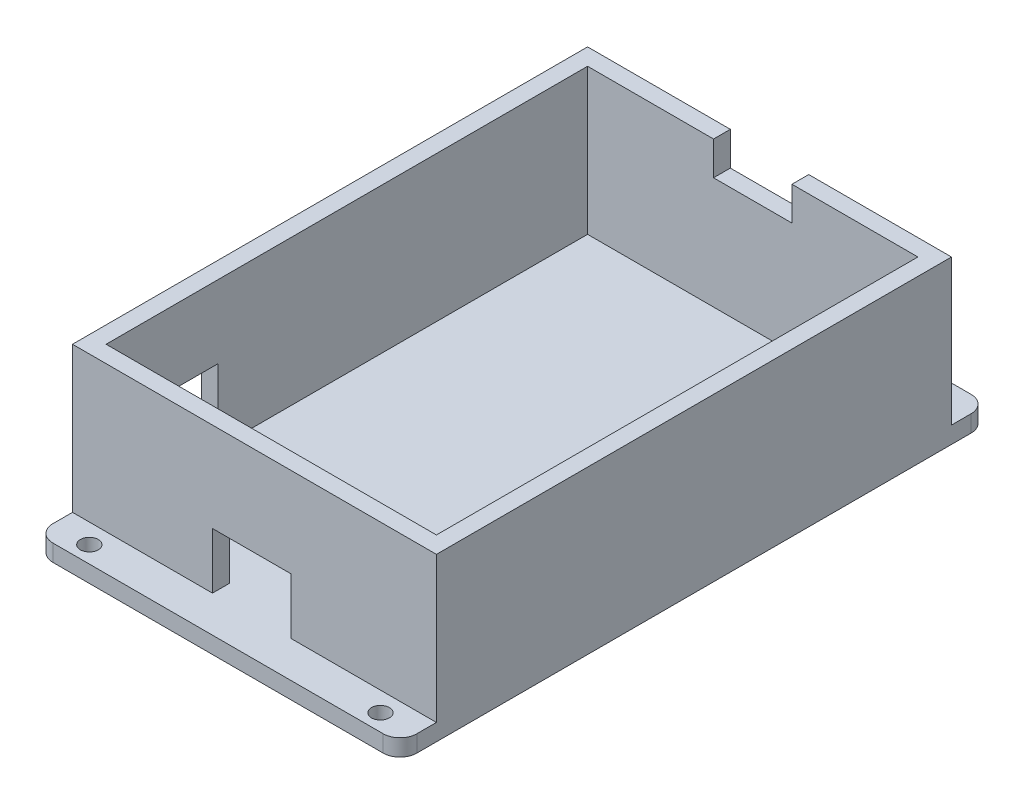
ISO-10303-21;
HEADER;
FILE_DESCRIPTION(('STEP AP214'),'2;1');
FILE_NAME('part.step','',(''),(''),'','','');
FILE_SCHEMA(('AUTOMOTIVE_DESIGN { 1 0 10303 214 1 1 1 1 }'));
ENDSEC;
DATA;
#1=APPLICATION_CONTEXT('core data for automotive mechanical design processes');
#2=APPLICATION_PROTOCOL_DEFINITION('international standard','automotive_design',2000,#1);
#3=PRODUCT_CONTEXT('',#1,'mechanical');
#4=PRODUCT('Part','Part','',(#3));
#5=PRODUCT_RELATED_PRODUCT_CATEGORY('part','',(#4));
#6=PRODUCT_DEFINITION_FORMATION('','',#4);
#7=PRODUCT_DEFINITION_CONTEXT('part definition',#1,'design');
#8=PRODUCT_DEFINITION('design','',#6,#7);
#9=PRODUCT_DEFINITION_SHAPE('','',#8);
#10=(LENGTH_UNIT() NAMED_UNIT(*) SI_UNIT(.MILLI.,.METRE.));
#11=(NAMED_UNIT(*) PLANE_ANGLE_UNIT() SI_UNIT($,.RADIAN.));
#12=(NAMED_UNIT(*) SI_UNIT($,.STERADIAN.) SOLID_ANGLE_UNIT());
#13=UNCERTAINTY_MEASURE_WITH_UNIT(LENGTH_MEASURE(1.E-05),#10,'distance_accuracy_value','');
#14=(GEOMETRIC_REPRESENTATION_CONTEXT(3) GLOBAL_UNCERTAINTY_ASSIGNED_CONTEXT((#13)) GLOBAL_UNIT_ASSIGNED_CONTEXT((#10,
#11,#12)) REPRESENTATION_CONTEXT('',''));
#15=CARTESIAN_POINT('',(0.,0.,0.));
#16=DIRECTION('',(0.,0.,1.));
#17=DIRECTION('',(1.,0.,0.));
#18=AXIS2_PLACEMENT_3D('',#15,#16,#17);
#19=CARTESIAN_POINT('',(0.,26.,0.));
#20=DIRECTION('',(0.,-1.,0.));
#21=DIRECTION('',(0.,0.,-1.));
#22=AXIS2_PLACEMENT_3D('',#19,#20,#21);
#23=PLANE('',#22);
#24=DIRECTION('',(-1.,0.,0.));
#25=VECTOR('',#24,1.);
#26=CARTESIAN_POINT('',(-29.5,26.,-43.));
#27=LINE('',#26,#25);
#28=CARTESIAN_POINT('',(-7.,26.,-43.));
#29=VERTEX_POINT('',#28);
#30=CARTESIAN_POINT('',(-29.5,26.,-43.));
#31=VERTEX_POINT('',#30);
#32=EDGE_CURVE('E362',#29,#31,#27,.T.);
#33=ORIENTED_EDGE('',*,*,#32,.F.);
#34=DIRECTION('',(0.,0.,-1.));
#35=VECTOR('',#34,1.);
#36=CARTESIAN_POINT('',(-7.,26.,-36.));
#37=LINE('',#36,#35);
#38=CARTESIAN_POINT('',(-7.,26.,-46.));
#39=VERTEX_POINT('',#38);
#40=EDGE_CURVE('E560',#29,#39,#37,.T.);
#41=ORIENTED_EDGE('',*,*,#40,.T.);
#42=DIRECTION('',(-1.,0.,0.));
#43=VECTOR('',#42,1.);
#44=CARTESIAN_POINT('',(-32.5,26.,-46.));
#45=LINE('',#44,#43);
#46=CARTESIAN_POINT('',(-32.5,26.,-46.));
#47=VERTEX_POINT('',#46);
#48=EDGE_CURVE('E257',#39,#47,#45,.T.);
#49=ORIENTED_EDGE('',*,*,#48,.T.);
#50=DIRECTION('',(0.,0.,1.));
#51=VECTOR('',#50,1.);
#52=CARTESIAN_POINT('',(-32.5,26.,46.));
#53=LINE('',#52,#51);
#54=CARTESIAN_POINT('',(-32.5,26.,46.));
#55=VERTEX_POINT('',#54);
#56=EDGE_CURVE('E256',#47,#55,#53,.T.);
#57=ORIENTED_EDGE('',*,*,#56,.T.);
#58=DIRECTION('',(1.,0.,0.));
#59=VECTOR('',#58,1.);
#60=CARTESIAN_POINT('',(-32.5,26.,46.));
#61=LINE('',#60,#59);
#62=CARTESIAN_POINT('',(32.5,26.,46.));
#63=VERTEX_POINT('',#62);
#64=EDGE_CURVE('E261',#55,#63,#61,.T.);
#65=ORIENTED_EDGE('',*,*,#64,.T.);
#66=DIRECTION('',(0.,0.,-1.));
#67=VECTOR('',#66,1.);
#68=CARTESIAN_POINT('',(32.5,26.,46.));
#69=LINE('',#68,#67);
#70=CARTESIAN_POINT('',(32.5,26.,-46.));
#71=VERTEX_POINT('',#70);
#72=EDGE_CURVE('E253',#63,#71,#69,.T.);
#73=ORIENTED_EDGE('',*,*,#72,.T.);
#74=CARTESIAN_POINT('',(7.,26.,-46.));
#75=VERTEX_POINT('',#74);
#76=EDGE_CURVE('E244',#71,#75,#45,.T.);
#77=ORIENTED_EDGE('',*,*,#76,.T.);
#78=DIRECTION('',(0.,0.,-1.));
#79=VECTOR('',#78,1.);
#80=CARTESIAN_POINT('',(7.,26.,-36.));
#81=LINE('',#80,#79);
#82=CARTESIAN_POINT('',(7.,26.,-43.));
#83=VERTEX_POINT('',#82);
#84=EDGE_CURVE('E226',#83,#75,#81,.T.);
#85=ORIENTED_EDGE('',*,*,#84,.F.);
#86=CARTESIAN_POINT('',(29.5,26.,-43.));
#87=VERTEX_POINT('',#86);
#88=EDGE_CURVE('E357',#87,#83,#27,.T.);
#89=ORIENTED_EDGE('',*,*,#88,.F.);
#90=DIRECTION('',(0.,0.,-1.));
#91=VECTOR('',#90,1.);
#92=CARTESIAN_POINT('',(29.5,26.,43.));
#93=LINE('',#92,#91);
#94=CARTESIAN_POINT('',(29.5,26.,43.));
#95=VERTEX_POINT('',#94);
#96=EDGE_CURVE('E369',#95,#87,#93,.T.);
#97=ORIENTED_EDGE('',*,*,#96,.F.);
#98=DIRECTION('',(1.,0.,0.));
#99=VECTOR('',#98,1.);
#100=CARTESIAN_POINT('',(-29.5,26.,43.));
#101=LINE('',#100,#99);
#102=CARTESIAN_POINT('',(-29.5,26.,43.));
#103=VERTEX_POINT('',#102);
#104=EDGE_CURVE('E367',#103,#95,#101,.T.);
#105=ORIENTED_EDGE('',*,*,#104,.F.);
#106=DIRECTION('',(0.,0.,1.));
#107=VECTOR('',#106,1.);
#108=CARTESIAN_POINT('',(-29.5,26.,43.));
#109=LINE('',#108,#107);
#110=EDGE_CURVE('E361',#31,#103,#109,.T.);
#111=ORIENTED_EDGE('',*,*,#110,.F.);
#112=EDGE_LOOP('',(#33,#41,#49,#57,#65,#73,#77,#85,#89,#97,#105,#111));
#113=FACE_BOUND('',#112,.T.);
#114=ADVANCED_FACE('F43',(#113),#23,.F.);
#115=CARTESIAN_POINT('',(32.5,26.,46.));
#116=DIRECTION('',(-1.,0.,0.));
#117=DIRECTION('',(0.,0.,1.));
#118=AXIS2_PLACEMENT_3D('',#115,#116,#117);
#119=PLANE('',#118);
#120=DIRECTION('',(0.,0.,1.));
#121=VECTOR('',#120,1.);
#122=CARTESIAN_POINT('',(32.5,0.,-52.5));
#123=LINE('',#122,#121);
#124=CARTESIAN_POINT('',(32.5,0.,46.));
#125=VERTEX_POINT('',#124);
#126=CARTESIAN_POINT('',(32.5,0.,49.5));
#127=VERTEX_POINT('',#126);
#128=EDGE_CURVE('E449',#125,#127,#123,.T.);
#129=ORIENTED_EDGE('',*,*,#128,.T.);
#130=DIRECTION('',(0.,1.,0.));
#131=VECTOR('',#130,1.);
#132=CARTESIAN_POINT('',(32.5,26.,49.5));
#133=LINE('',#132,#131);
#134=CARTESIAN_POINT('',(32.5,-3.,49.5));
#135=VERTEX_POINT('',#134);
#136=EDGE_CURVE('E311',#127,#135,#133,.F.);
#137=ORIENTED_EDGE('',*,*,#136,.T.);
#138=DIRECTION('',(0.,0.,1.));
#139=VECTOR('',#138,1.);
#140=CARTESIAN_POINT('',(32.5,-3.,-52.5));
#141=LINE('',#140,#139);
#142=CARTESIAN_POINT('',(32.5,-3.,-49.5));
#143=VERTEX_POINT('',#142);
#144=EDGE_CURVE('E430',#143,#135,#141,.T.);
#145=ORIENTED_EDGE('',*,*,#144,.F.);
#146=DIRECTION('',(0.,1.,0.));
#147=VECTOR('',#146,1.);
#148=CARTESIAN_POINT('',(32.5,26.,-49.5));
#149=LINE('',#148,#147);
#150=CARTESIAN_POINT('',(32.5,0.,-49.5));
#151=VERTEX_POINT('',#150);
#152=EDGE_CURVE('E307',#143,#151,#149,.T.);
#153=ORIENTED_EDGE('',*,*,#152,.T.);
#154=CARTESIAN_POINT('',(32.5,0.,-46.));
#155=VERTEX_POINT('',#154);
#156=EDGE_CURVE('E446',#151,#155,#123,.T.);
#157=ORIENTED_EDGE('',*,*,#156,.T.);
#158=DIRECTION('',(0.,-1.,0.));
#159=VECTOR('',#158,1.);
#160=CARTESIAN_POINT('',(32.5,26.,-46.));
#161=LINE('',#160,#159);
#162=EDGE_CURVE('E290',#71,#155,#161,.T.);
#163=ORIENTED_EDGE('',*,*,#162,.F.);
#164=ORIENTED_EDGE('',*,*,#72,.F.);
#165=DIRECTION('',(0.,-1.,0.));
#166=VECTOR('',#165,1.);
#167=CARTESIAN_POINT('',(32.5,26.,46.));
#168=LINE('',#167,#166);
#169=EDGE_CURVE('E268',#63,#125,#168,.T.);
#170=ORIENTED_EDGE('',*,*,#169,.T.);
#171=EDGE_LOOP('',(#129,#137,#145,#153,#157,#163,#164,#170));
#172=FACE_BOUND('',#171,.T.);
#173=ADVANCED_FACE('F617',(#172),#119,.F.);
#174=CARTESIAN_POINT('',(-32.5,26.,-46.));
#175=DIRECTION('',(0.,0.,1.));
#176=DIRECTION('',(1.,0.,0.));
#177=AXIS2_PLACEMENT_3D('',#174,#175,#176);
#178=PLANE('',#177);
#179=ORIENTED_EDGE('',*,*,#48,.F.);
#180=DIRECTION('',(0.,1.,0.));
#181=VECTOR('',#180,1.);
#182=CARTESIAN_POINT('',(-7.,20.,-46.));
#183=LINE('',#182,#181);
#184=CARTESIAN_POINT('',(-7.,20.,-46.));
#185=VERTEX_POINT('',#184);
#186=EDGE_CURVE('E238',#185,#39,#183,.T.);
#187=ORIENTED_EDGE('',*,*,#186,.F.);
#188=DIRECTION('',(-1.,0.,0.));
#189=VECTOR('',#188,1.);
#190=CARTESIAN_POINT('',(7.,20.,-46.));
#191=LINE('',#190,#189);
#192=CARTESIAN_POINT('',(7.,20.,-46.));
#193=VERTEX_POINT('',#192);
#194=EDGE_CURVE('E248',#193,#185,#191,.T.);
#195=ORIENTED_EDGE('',*,*,#194,.F.);
#196=DIRECTION('',(0.,-1.,0.));
#197=VECTOR('',#196,1.);
#198=CARTESIAN_POINT('',(7.,26.,-46.));
#199=LINE('',#198,#197);
#200=EDGE_CURVE('E229',#75,#193,#199,.T.);
#201=ORIENTED_EDGE('',*,*,#200,.F.);
#202=ORIENTED_EDGE('',*,*,#76,.F.);
#203=ORIENTED_EDGE('',*,*,#162,.T.);
#204=DIRECTION('',(-1.,0.,0.));
#205=VECTOR('',#204,1.);
#206=CARTESIAN_POINT('',(-32.5,0.,-46.));
#207=LINE('',#206,#205);
#208=CARTESIAN_POINT('',(-32.5,0.,-46.));
#209=VERTEX_POINT('',#208);
#210=EDGE_CURVE('E269',#155,#209,#207,.T.);
#211=ORIENTED_EDGE('',*,*,#210,.T.);
#212=DIRECTION('',(0.,-1.,0.));
#213=VECTOR('',#212,1.);
#214=CARTESIAN_POINT('',(-32.5,26.,-46.));
#215=LINE('',#214,#213);
#216=EDGE_CURVE('E286',#47,#209,#215,.T.);
#217=ORIENTED_EDGE('',*,*,#216,.F.);
#218=EDGE_LOOP('',(#179,#187,#195,#201,#202,#203,#211,#217));
#219=FACE_BOUND('',#218,.T.);
#220=ADVANCED_FACE('F242',(#219),#178,.F.);
#221=CARTESIAN_POINT('',(-32.5,26.,46.));
#222=DIRECTION('',(1.,0.,0.));
#223=DIRECTION('',(0.,0.,-1.));
#224=AXIS2_PLACEMENT_3D('',#221,#222,#223);
#225=PLANE('',#224);
#226=DIRECTION('',(0.,-1.,0.));
#227=VECTOR('',#226,1.);
#228=CARTESIAN_POINT('',(-32.5,2.,33.));
#229=LINE('',#228,#227);
#230=CARTESIAN_POINT('',(-32.5,13.,33.));
#231=VERTEX_POINT('',#230);
#232=CARTESIAN_POINT('',(-32.5,2.,33.));
#233=VERTEX_POINT('',#232);
#234=EDGE_CURVE('E531',#231,#233,#229,.T.);
#235=ORIENTED_EDGE('',*,*,#234,.T.);
#236=DIRECTION('',(0.,0.,-1.));
#237=VECTOR('',#236,1.);
#238=CARTESIAN_POINT('',(-32.5,2.,33.));
#239=LINE('',#238,#237);
#240=CARTESIAN_POINT('',(-32.5,2.,23.));
#241=VERTEX_POINT('',#240);
#242=EDGE_CURVE('E541',#233,#241,#239,.T.);
#243=ORIENTED_EDGE('',*,*,#242,.T.);
#244=DIRECTION('',(0.,1.,0.));
#245=VECTOR('',#244,1.);
#246=CARTESIAN_POINT('',(-32.5,13.,23.));
#247=LINE('',#246,#245);
#248=CARTESIAN_POINT('',(-32.5,13.,23.));
#249=VERTEX_POINT('',#248);
#250=EDGE_CURVE('E537',#241,#249,#247,.T.);
#251=ORIENTED_EDGE('',*,*,#250,.T.);
#252=DIRECTION('',(0.,0.,1.));
#253=VECTOR('',#252,1.);
#254=CARTESIAN_POINT('',(-32.5,13.,33.));
#255=LINE('',#254,#253);
#256=EDGE_CURVE('E67',#249,#231,#255,.T.);
#257=ORIENTED_EDGE('',*,*,#256,.T.);
#258=EDGE_LOOP('',(#235,#243,#251,#257));
#259=FACE_BOUND('',#258,.T.);
#260=DIRECTION('',(0.,0.,-1.));
#261=VECTOR('',#260,1.);
#262=CARTESIAN_POINT('',(-32.5,-3.,-52.5));
#263=LINE('',#262,#261);
#264=CARTESIAN_POINT('',(-32.5,-3.,49.5));
#265=VERTEX_POINT('',#264);
#266=CARTESIAN_POINT('',(-32.5,-3.,-49.5));
#267=VERTEX_POINT('',#266);
#268=EDGE_CURVE('E422',#265,#267,#263,.T.);
#269=ORIENTED_EDGE('',*,*,#268,.F.);
#270=DIRECTION('',(0.,1.,0.));
#271=VECTOR('',#270,1.);
#272=CARTESIAN_POINT('',(-32.5,26.,49.5));
#273=LINE('',#272,#271);
#274=CARTESIAN_POINT('',(-32.5,0.,49.5));
#275=VERTEX_POINT('',#274);
#276=EDGE_CURVE('E329',#265,#275,#273,.T.);
#277=ORIENTED_EDGE('',*,*,#276,.T.);
#278=DIRECTION('',(0.,0.,-1.));
#279=VECTOR('',#278,1.);
#280=CARTESIAN_POINT('',(-32.5,0.,-52.5));
#281=LINE('',#280,#279);
#282=CARTESIAN_POINT('',(-32.5,0.,46.));
#283=VERTEX_POINT('',#282);
#284=EDGE_CURVE('E438',#275,#283,#281,.T.);
#285=ORIENTED_EDGE('',*,*,#284,.T.);
#286=DIRECTION('',(0.,-1.,0.));
#287=VECTOR('',#286,1.);
#288=CARTESIAN_POINT('',(-32.5,26.,46.));
#289=LINE('',#288,#287);
#290=EDGE_CURVE('E282',#55,#283,#289,.T.);
#291=ORIENTED_EDGE('',*,*,#290,.F.);
#292=ORIENTED_EDGE('',*,*,#56,.F.);
#293=ORIENTED_EDGE('',*,*,#216,.T.);
#294=CARTESIAN_POINT('',(-32.5,0.,-49.5));
#295=VERTEX_POINT('',#294);
#296=EDGE_CURVE('E440',#209,#295,#281,.T.);
#297=ORIENTED_EDGE('',*,*,#296,.T.);
#298=DIRECTION('',(0.,1.,0.));
#299=VECTOR('',#298,1.);
#300=CARTESIAN_POINT('',(-32.5,26.,-49.5));
#301=LINE('',#300,#299);
#302=EDGE_CURVE('E326',#295,#267,#301,.F.);
#303=ORIENTED_EDGE('',*,*,#302,.T.);
#304=EDGE_LOOP('',(#269,#277,#285,#291,#292,#293,#297,#303));
#305=FACE_BOUND('',#304,.T.);
#306=ADVANCED_FACE('F598',(#259,#305),#225,.F.);
#307=CARTESIAN_POINT('',(-32.5,26.,46.));
#308=DIRECTION('',(0.,0.,-1.));
#309=DIRECTION('',(-1.,0.,0.));
#310=AXIS2_PLACEMENT_3D('',#307,#308,#309);
#311=PLANE('',#310);
#312=DIRECTION('',(1.,0.,0.));
#313=VECTOR('',#312,1.);
#314=CARTESIAN_POINT('',(-32.5,10.,46.));
#315=LINE('',#314,#313);
#316=CARTESIAN_POINT('',(-7.50000000000001,10.,46.));
#317=VERTEX_POINT('',#316);
#318=CARTESIAN_POINT('',(6.49999999999999,10.,46.));
#319=VERTEX_POINT('',#318);
#320=EDGE_CURVE('E484',#317,#319,#315,.T.);
#321=ORIENTED_EDGE('',*,*,#320,.T.);
#322=DIRECTION('',(0.,-1.,0.));
#323=VECTOR('',#322,1.);
#324=CARTESIAN_POINT('',(6.49999999999998,26.,46.));
#325=LINE('',#324,#323);
#326=CARTESIAN_POINT('',(6.49999999999999,0.,46.));
#327=VERTEX_POINT('',#326);
#328=EDGE_CURVE('E488',#319,#327,#325,.T.);
#329=ORIENTED_EDGE('',*,*,#328,.T.);
#330=DIRECTION('',(1.,0.,0.));
#331=VECTOR('',#330,1.);
#332=CARTESIAN_POINT('',(-32.5,0.,46.));
#333=LINE('',#332,#331);
#334=EDGE_CURVE('E273',#327,#125,#333,.T.);
#335=ORIENTED_EDGE('',*,*,#334,.T.);
#336=ORIENTED_EDGE('',*,*,#169,.F.);
#337=ORIENTED_EDGE('',*,*,#64,.F.);
#338=ORIENTED_EDGE('',*,*,#290,.T.);
#339=CARTESIAN_POINT('',(-7.50000000000001,0.,46.));
#340=VERTEX_POINT('',#339);
#341=EDGE_CURVE('E275',#283,#340,#333,.T.);
#342=ORIENTED_EDGE('',*,*,#341,.T.);
#343=DIRECTION('',(0.,1.,0.));
#344=VECTOR('',#343,1.);
#345=CARTESIAN_POINT('',(-7.5,26.,46.));
#346=LINE('',#345,#344);
#347=EDGE_CURVE('E492',#340,#317,#346,.T.);
#348=ORIENTED_EDGE('',*,*,#347,.T.);
#349=EDGE_LOOP('',(#321,#329,#335,#336,#337,#338,#342,#348));
#350=FACE_BOUND('',#349,.T.);
#351=ADVANCED_FACE('F590',(#350),#311,.F.);
#352=CARTESIAN_POINT('',(29.5,26.,43.));
#353=DIRECTION('',(-1.,0.,0.));
#354=DIRECTION('',(0.,0.,1.));
#355=AXIS2_PLACEMENT_3D('',#352,#353,#354);
#356=PLANE('',#355);
#357=DIRECTION('',(0.,0.,-1.));
#358=VECTOR('',#357,1.);
#359=CARTESIAN_POINT('',(29.5,0.,43.));
#360=LINE('',#359,#358);
#361=CARTESIAN_POINT('',(29.5,0.,43.));
#362=VERTEX_POINT('',#361);
#363=CARTESIAN_POINT('',(29.5,0.,-43.));
#364=VERTEX_POINT('',#363);
#365=EDGE_CURVE('E376',#362,#364,#360,.T.);
#366=ORIENTED_EDGE('',*,*,#365,.F.);
#367=DIRECTION('',(0.,-1.,0.));
#368=VECTOR('',#367,1.);
#369=CARTESIAN_POINT('',(29.5,26.,43.));
#370=LINE('',#369,#368);
#371=EDGE_CURVE('E375',#95,#362,#370,.T.);
#372=ORIENTED_EDGE('',*,*,#371,.F.);
#373=ORIENTED_EDGE('',*,*,#96,.T.);
#374=DIRECTION('',(0.,-1.,0.));
#375=VECTOR('',#374,1.);
#376=CARTESIAN_POINT('',(29.5,26.,-43.));
#377=LINE('',#376,#375);
#378=EDGE_CURVE('E274',#87,#364,#377,.T.);
#379=ORIENTED_EDGE('',*,*,#378,.T.);
#380=EDGE_LOOP('',(#366,#372,#373,#379));
#381=FACE_BOUND('',#380,.T.);
#382=ADVANCED_FACE('F406',(#381),#356,.T.);
#383=CARTESIAN_POINT('',(-29.5,26.,-43.));
#384=DIRECTION('',(0.,0.,1.));
#385=DIRECTION('',(1.,0.,0.));
#386=AXIS2_PLACEMENT_3D('',#383,#384,#385);
#387=PLANE('',#386);
#388=DIRECTION('',(0.,-1.,0.));
#389=VECTOR('',#388,1.);
#390=CARTESIAN_POINT('',(-7.,26.,-43.));
#391=LINE('',#390,#389);
#392=CARTESIAN_POINT('',(-7.,20.,-43.));
#393=VERTEX_POINT('',#392);
#394=EDGE_CURVE('E11',#29,#393,#391,.T.);
#395=ORIENTED_EDGE('',*,*,#394,.F.);
#396=ORIENTED_EDGE('',*,*,#32,.T.);
#397=DIRECTION('',(0.,-1.,0.));
#398=VECTOR('',#397,1.);
#399=CARTESIAN_POINT('',(-29.5,26.,-43.));
#400=LINE('',#399,#398);
#401=CARTESIAN_POINT('',(-29.5,0.,-43.));
#402=VERTEX_POINT('',#401);
#403=EDGE_CURVE('E401',#31,#402,#400,.T.);
#404=ORIENTED_EDGE('',*,*,#403,.T.);
#405=DIRECTION('',(-1.,0.,0.));
#406=VECTOR('',#405,1.);
#407=CARTESIAN_POINT('',(-29.5,0.,-43.));
#408=LINE('',#407,#406);
#409=EDGE_CURVE('E380',#364,#402,#408,.T.);
#410=ORIENTED_EDGE('',*,*,#409,.F.);
#411=ORIENTED_EDGE('',*,*,#378,.F.);
#412=ORIENTED_EDGE('',*,*,#88,.T.);
#413=DIRECTION('',(0.,1.,0.));
#414=VECTOR('',#413,1.);
#415=CARTESIAN_POINT('',(7.,26.,-43.));
#416=LINE('',#415,#414);
#417=CARTESIAN_POINT('',(7.,20.,-43.));
#418=VERTEX_POINT('',#417);
#419=EDGE_CURVE('E232',#418,#83,#416,.T.);
#420=ORIENTED_EDGE('',*,*,#419,.F.);
#421=DIRECTION('',(1.,0.,0.));
#422=VECTOR('',#421,1.);
#423=CARTESIAN_POINT('',(-29.5,20.,-43.));
#424=LINE('',#423,#422);
#425=EDGE_CURVE('E52',#393,#418,#424,.T.);
#426=ORIENTED_EDGE('',*,*,#425,.F.);
#427=EDGE_LOOP('',(#395,#396,#404,#410,#411,#412,#420,#426));
#428=FACE_BOUND('',#427,.T.);
#429=ADVANCED_FACE('F355',(#428),#387,.T.);
#430=CARTESIAN_POINT('',(-29.5,26.,43.));
#431=DIRECTION('',(1.,0.,0.));
#432=DIRECTION('',(0.,0.,-1.));
#433=AXIS2_PLACEMENT_3D('',#430,#431,#432);
#434=PLANE('',#433);
#435=DIRECTION('',(0.,0.,-1.));
#436=VECTOR('',#435,1.);
#437=CARTESIAN_POINT('',(-29.5,2.,33.));
#438=LINE('',#437,#436);
#439=CARTESIAN_POINT('',(-29.5,2.,33.));
#440=VERTEX_POINT('',#439);
#441=CARTESIAN_POINT('',(-29.5,2.,23.));
#442=VERTEX_POINT('',#441);
#443=EDGE_CURVE('E557',#440,#442,#438,.T.);
#444=ORIENTED_EDGE('',*,*,#443,.F.);
#445=DIRECTION('',(0.,-1.,0.));
#446=VECTOR('',#445,1.);
#447=CARTESIAN_POINT('',(-29.5,2.,33.));
#448=LINE('',#447,#446);
#449=CARTESIAN_POINT('',(-29.5,13.,33.));
#450=VERTEX_POINT('',#449);
#451=EDGE_CURVE('E545',#450,#440,#448,.T.);
#452=ORIENTED_EDGE('',*,*,#451,.F.);
#453=DIRECTION('',(0.,0.,1.));
#454=VECTOR('',#453,1.);
#455=CARTESIAN_POINT('',(-29.5,13.,33.));
#456=LINE('',#455,#454);
#457=CARTESIAN_POINT('',(-29.5,13.,23.));
#458=VERTEX_POINT('',#457);
#459=EDGE_CURVE('E549',#458,#450,#456,.T.);
#460=ORIENTED_EDGE('',*,*,#459,.F.);
#461=DIRECTION('',(0.,1.,0.));
#462=VECTOR('',#461,1.);
#463=CARTESIAN_POINT('',(-29.5,13.,23.));
#464=LINE('',#463,#462);
#465=EDGE_CURVE('E553',#442,#458,#464,.T.);
#466=ORIENTED_EDGE('',*,*,#465,.F.);
#467=EDGE_LOOP('',(#444,#452,#460,#466));
#468=FACE_BOUND('',#467,.T.);
#469=DIRECTION('',(0.,0.,1.));
#470=VECTOR('',#469,1.);
#471=CARTESIAN_POINT('',(-29.5,0.,43.));
#472=LINE('',#471,#470);
#473=CARTESIAN_POINT('',(-29.5,0.,43.));
#474=VERTEX_POINT('',#473);
#475=EDGE_CURVE('E385',#402,#474,#472,.T.);
#476=ORIENTED_EDGE('',*,*,#475,.F.);
#477=ORIENTED_EDGE('',*,*,#403,.F.);
#478=ORIENTED_EDGE('',*,*,#110,.T.);
#479=DIRECTION('',(0.,-1.,0.));
#480=VECTOR('',#479,1.);
#481=CARTESIAN_POINT('',(-29.5,26.,43.));
#482=LINE('',#481,#480);
#483=EDGE_CURVE('E397',#103,#474,#482,.T.);
#484=ORIENTED_EDGE('',*,*,#483,.T.);
#485=EDGE_LOOP('',(#476,#477,#478,#484));
#486=FACE_BOUND('',#485,.T.);
#487=ADVANCED_FACE('F580',(#468,#486),#434,.T.);
#488=CARTESIAN_POINT('',(-29.5,26.,43.));
#489=DIRECTION('',(0.,0.,-1.));
#490=DIRECTION('',(-1.,0.,0.));
#491=AXIS2_PLACEMENT_3D('',#488,#489,#490);
#492=PLANE('',#491);
#493=DIRECTION('',(0.,-1.,0.));
#494=VECTOR('',#493,1.);
#495=CARTESIAN_POINT('',(6.49999999999999,10.,43.));
#496=LINE('',#495,#494);
#497=CARTESIAN_POINT('',(6.49999999999999,10.,43.));
#498=VERTEX_POINT('',#497);
#499=CARTESIAN_POINT('',(6.49999999999998,0.,43.));
#500=VERTEX_POINT('',#499);
#501=EDGE_CURVE('E507',#498,#500,#496,.T.);
#502=ORIENTED_EDGE('',*,*,#501,.F.);
#503=DIRECTION('',(1.,0.,0.));
#504=VECTOR('',#503,1.);
#505=CARTESIAN_POINT('',(-7.50000000000001,10.,43.));
#506=LINE('',#505,#504);
#507=CARTESIAN_POINT('',(-7.50000000000001,10.,43.));
#508=VERTEX_POINT('',#507);
#509=EDGE_CURVE('E510',#508,#498,#506,.T.);
#510=ORIENTED_EDGE('',*,*,#509,.F.);
#511=DIRECTION('',(0.,1.,0.));
#512=VECTOR('',#511,1.);
#513=CARTESIAN_POINT('',(-7.50000000000001,0.,43.));
#514=LINE('',#513,#512);
#515=CARTESIAN_POINT('',(-7.50000000000001,0.,43.));
#516=VERTEX_POINT('',#515);
#517=EDGE_CURVE('E514',#516,#508,#514,.T.);
#518=ORIENTED_EDGE('',*,*,#517,.F.);
#519=DIRECTION('',(1.,0.,0.));
#520=VECTOR('',#519,1.);
#521=CARTESIAN_POINT('',(-29.5,0.,43.));
#522=LINE('',#521,#520);
#523=EDGE_CURVE('E390',#474,#516,#522,.T.);
#524=ORIENTED_EDGE('',*,*,#523,.F.);
#525=ORIENTED_EDGE('',*,*,#483,.F.);
#526=ORIENTED_EDGE('',*,*,#104,.T.);
#527=ORIENTED_EDGE('',*,*,#371,.T.);
#528=EDGE_CURVE('E389',#500,#362,#522,.T.);
#529=ORIENTED_EDGE('',*,*,#528,.F.);
#530=EDGE_LOOP('',(#502,#510,#518,#524,#525,#526,#527,#529));
#531=FACE_BOUND('',#530,.T.);
#532=ADVANCED_FACE('F584',(#531),#492,.T.);
#533=CARTESIAN_POINT('',(0.,0.,0.));
#534=DIRECTION('',(0.,1.,0.));
#535=DIRECTION('',(0.,0.,1.));
#536=AXIS2_PLACEMENT_3D('',#533,#534,#535);
#537=PLANE('',#536);
#538=CARTESIAN_POINT('',(-29.5,0.,49.5));
#539=DIRECTION('',(0.,1.,0.));
#540=DIRECTION('',(0.,0.,1.));
#541=AXIS2_PLACEMENT_3D('',#538,#539,#540);
#542=CIRCLE('',#541,3.);
#543=CARTESIAN_POINT('',(-29.5,0.,52.5));
#544=VERTEX_POINT('',#543);
#545=EDGE_CURVE('E300',#275,#544,#542,.T.);
#546=ORIENTED_EDGE('',*,*,#545,.T.);
#547=DIRECTION('',(-1.,0.,0.));
#548=VECTOR('',#547,1.);
#549=CARTESIAN_POINT('',(-32.5,0.,52.5));
#550=LINE('',#549,#548);
#551=CARTESIAN_POINT('',(29.5,0.,52.5));
#552=VERTEX_POINT('',#551);
#553=EDGE_CURVE('E444',#552,#544,#550,.T.);
#554=ORIENTED_EDGE('',*,*,#553,.F.);
#555=CARTESIAN_POINT('',(29.5,0.,49.5));
#556=DIRECTION('',(0.,1.,0.));
#557=DIRECTION('',(0.,0.,1.));
#558=AXIS2_PLACEMENT_3D('',#555,#556,#557);
#559=CIRCLE('',#558,3.);
#560=EDGE_CURVE('E304',#552,#127,#559,.T.);
#561=ORIENTED_EDGE('',*,*,#560,.T.);
#562=ORIENTED_EDGE('',*,*,#128,.F.);
#563=ORIENTED_EDGE('',*,*,#334,.F.);
#564=DIRECTION('',(0.,0.,-1.));
#565=VECTOR('',#564,1.);
#566=CARTESIAN_POINT('',(6.49999999999999,0.,52.5));
#567=LINE('',#566,#565);
#568=EDGE_CURVE('E414',#327,#500,#567,.T.);
#569=ORIENTED_EDGE('',*,*,#568,.T.);
#570=ORIENTED_EDGE('',*,*,#528,.T.);
#571=ORIENTED_EDGE('',*,*,#365,.T.);
#572=ORIENTED_EDGE('',*,*,#409,.T.);
#573=ORIENTED_EDGE('',*,*,#475,.T.);
#574=ORIENTED_EDGE('',*,*,#523,.T.);
#575=DIRECTION('',(0.,0.,-1.));
#576=VECTOR('',#575,1.);
#577=CARTESIAN_POINT('',(-7.50000000000001,0.,52.5));
#578=LINE('',#577,#576);
#579=EDGE_CURVE('E504',#340,#516,#578,.T.);
#580=ORIENTED_EDGE('',*,*,#579,.F.);
#581=ORIENTED_EDGE('',*,*,#341,.F.);
#582=ORIENTED_EDGE('',*,*,#284,.F.);
#583=EDGE_LOOP('',(#546,#554,#561,#562,#563,#569,#570,#571,#572,#573,#574,#580,#581,#582));
#584=FACE_BOUND('',#583,.T.);
#585=CARTESIAN_POINT('',(-26.,0.,49.5));
#586=DIRECTION('',(0.,1.,0.));
#587=DIRECTION('',(0.,0.,1.));
#588=AXIS2_PLACEMENT_3D('',#585,#586,#587);
#589=CIRCLE('',#588,1.6);
#590=CARTESIAN_POINT('',(-26.,0.,51.1));
#591=VERTEX_POINT('',#590);
#592=EDGE_CURVE('E453',#591,#591,#589,.T.);
#593=ORIENTED_EDGE('',*,*,#592,.F.);
#594=EDGE_LOOP('',(#593));
#595=FACE_BOUND('',#594,.T.);
#596=CARTESIAN_POINT('',(26.,0.,49.5));
#597=DIRECTION('',(0.,1.,0.));
#598=DIRECTION('',(0.,0.,1.));
#599=AXIS2_PLACEMENT_3D('',#596,#597,#598);
#600=CIRCLE('',#599,1.6);
#601=CARTESIAN_POINT('',(26.,0.,51.1));
#602=VERTEX_POINT('',#601);
#603=EDGE_CURVE('E456',#602,#602,#600,.T.);
#604=ORIENTED_EDGE('',*,*,#603,.F.);
#605=EDGE_LOOP('',(#604));
#606=FACE_BOUND('',#605,.T.);
#607=ADVANCED_FACE('F409',(#584,#595,#606),#537,.T.);
#608=CARTESIAN_POINT('',(26.,0.,-49.5));
#609=DIRECTION('',(0.,1.,0.));
#610=DIRECTION('',(0.,0.,1.));
#611=AXIS2_PLACEMENT_3D('',#608,#609,#610);
#612=CIRCLE('',#611,1.6);
#613=CARTESIAN_POINT('',(26.,0.,-47.9));
#614=VERTEX_POINT('',#613);
#615=EDGE_CURVE('E460',#614,#614,#612,.T.);
#616=ORIENTED_EDGE('',*,*,#615,.F.);
#617=EDGE_LOOP('',(#616));
#618=FACE_BOUND('',#617,.T.);
#619=CARTESIAN_POINT('',(-26.,0.,-49.5));
#620=DIRECTION('',(0.,1.,0.));
#621=DIRECTION('',(0.,0.,1.));
#622=AXIS2_PLACEMENT_3D('',#619,#620,#621);
#623=CIRCLE('',#622,1.6);
#624=CARTESIAN_POINT('',(-26.,0.,-47.9));
#625=VERTEX_POINT('',#624);
#626=EDGE_CURVE('E464',#625,#625,#623,.T.);
#627=ORIENTED_EDGE('',*,*,#626,.F.);
#628=EDGE_LOOP('',(#627));
#629=FACE_BOUND('',#628,.T.);
#630=DIRECTION('',(1.,0.,0.));
#631=VECTOR('',#630,1.);
#632=CARTESIAN_POINT('',(-32.5,0.,-52.5));
#633=LINE('',#632,#631);
#634=CARTESIAN_POINT('',(-29.5,0.,-52.5));
#635=VERTEX_POINT('',#634);
#636=CARTESIAN_POINT('',(29.5,0.,-52.5));
#637=VERTEX_POINT('',#636);
#638=EDGE_CURVE('E434',#635,#637,#633,.T.);
#639=ORIENTED_EDGE('',*,*,#638,.F.);
#640=CARTESIAN_POINT('',(-29.5,0.,-49.5));
#641=DIRECTION('',(0.,1.,0.));
#642=DIRECTION('',(0.,0.,1.));
#643=AXIS2_PLACEMENT_3D('',#640,#641,#642);
#644=CIRCLE('',#643,3.);
#645=EDGE_CURVE('E343',#635,#295,#644,.T.);
#646=ORIENTED_EDGE('',*,*,#645,.T.);
#647=ORIENTED_EDGE('',*,*,#296,.F.);
#648=ORIENTED_EDGE('',*,*,#210,.F.);
#649=ORIENTED_EDGE('',*,*,#156,.F.);
#650=CARTESIAN_POINT('',(29.5,0.,-49.5));
#651=DIRECTION('',(0.,1.,0.));
#652=DIRECTION('',(0.,0.,1.));
#653=AXIS2_PLACEMENT_3D('',#650,#651,#652);
#654=CIRCLE('',#653,3.);
#655=EDGE_CURVE('E340',#151,#637,#654,.T.);
#656=ORIENTED_EDGE('',*,*,#655,.T.);
#657=EDGE_LOOP('',(#639,#646,#647,#648,#649,#656));
#658=FACE_BOUND('',#657,.T.);
#659=ADVANCED_FACE('F673',(#618,#629,#658),#537,.T.);
#660=CARTESIAN_POINT('',(-32.5,-3.,52.5));
#661=DIRECTION('',(0.,0.,-1.));
#662=DIRECTION('',(-1.,0.,0.));
#663=AXIS2_PLACEMENT_3D('',#660,#661,#662);
#664=PLANE('',#663);
#665=DIRECTION('',(-1.,0.,0.));
#666=VECTOR('',#665,1.);
#667=CARTESIAN_POINT('',(-32.5,-3.,52.5));
#668=LINE('',#667,#666);
#669=CARTESIAN_POINT('',(29.5,-3.,52.5));
#670=VERTEX_POINT('',#669);
#671=CARTESIAN_POINT('',(-29.5,-3.,52.5));
#672=VERTEX_POINT('',#671);
#673=EDGE_CURVE('E426',#670,#672,#668,.T.);
#674=ORIENTED_EDGE('',*,*,#673,.F.);
#675=DIRECTION('',(0.,1.,0.));
#676=VECTOR('',#675,1.);
#677=CARTESIAN_POINT('',(29.5,-3.,52.5));
#678=LINE('',#677,#676);
#679=EDGE_CURVE('E296',#670,#552,#678,.T.);
#680=ORIENTED_EDGE('',*,*,#679,.T.);
#681=ORIENTED_EDGE('',*,*,#553,.T.);
#682=DIRECTION('',(0.,1.,0.));
#683=VECTOR('',#682,1.);
#684=CARTESIAN_POINT('',(-29.5,-3.,52.5));
#685=LINE('',#684,#683);
#686=EDGE_CURVE('E293',#544,#672,#685,.F.);
#687=ORIENTED_EDGE('',*,*,#686,.T.);
#688=EDGE_LOOP('',(#674,#680,#681,#687));
#689=FACE_BOUND('',#688,.T.);
#690=ADVANCED_FACE('F606',(#689),#664,.F.);
#691=CARTESIAN_POINT('',(-32.5,-3.,-52.5));
#692=DIRECTION('',(0.,0.,1.));
#693=DIRECTION('',(1.,0.,0.));
#694=AXIS2_PLACEMENT_3D('',#691,#692,#693);
#695=PLANE('',#694);
#696=DIRECTION('',(1.,0.,0.));
#697=VECTOR('',#696,1.);
#698=CARTESIAN_POINT('',(-32.5,-3.,-52.5));
#699=LINE('',#698,#697);
#700=CARTESIAN_POINT('',(-29.5,-3.,-52.5));
#701=VERTEX_POINT('',#700);
#702=CARTESIAN_POINT('',(29.5,-3.,-52.5));
#703=VERTEX_POINT('',#702);
#704=EDGE_CURVE('E381',#701,#703,#699,.T.);
#705=ORIENTED_EDGE('',*,*,#704,.F.);
#706=DIRECTION('',(0.,1.,0.));
#707=VECTOR('',#706,1.);
#708=CARTESIAN_POINT('',(-29.5,-3.,-52.5));
#709=LINE('',#708,#707);
#710=EDGE_CURVE('E336',#701,#635,#709,.T.);
#711=ORIENTED_EDGE('',*,*,#710,.T.);
#712=ORIENTED_EDGE('',*,*,#638,.T.);
#713=DIRECTION('',(0.,1.,0.));
#714=VECTOR('',#713,1.);
#715=CARTESIAN_POINT('',(29.5,-3.,-52.5));
#716=LINE('',#715,#714);
#717=EDGE_CURVE('E333',#637,#703,#716,.F.);
#718=ORIENTED_EDGE('',*,*,#717,.T.);
#719=EDGE_LOOP('',(#705,#711,#712,#718));
#720=FACE_BOUND('',#719,.T.);
#721=ADVANCED_FACE('F666',(#720),#695,.F.);
#722=CARTESIAN_POINT('',(0.,-3.,0.));
#723=DIRECTION('',(0.,1.,0.));
#724=DIRECTION('',(0.,0.,1.));
#725=AXIS2_PLACEMENT_3D('',#722,#723,#724);
#726=PLANE('',#725);
#727=CARTESIAN_POINT('',(-26.,-3.,49.5));
#728=DIRECTION('',(0.,1.,0.));
#729=DIRECTION('',(0.,0.,-1.));
#730=AXIS2_PLACEMENT_3D('',#727,#728,#729);
#731=CIRCLE('',#730,1.6);
#732=CARTESIAN_POINT('',(-26.,-3.,47.9));
#733=VERTEX_POINT('',#732);
#734=EDGE_CURVE('E480',#733,#733,#731,.T.);
#735=ORIENTED_EDGE('',*,*,#734,.T.);
#736=EDGE_LOOP('',(#735));
#737=FACE_BOUND('',#736,.T.);
#738=CARTESIAN_POINT('',(26.,-3.,49.5));
#739=DIRECTION('',(0.,1.,0.));
#740=DIRECTION('',(0.,0.,1.));
#741=AXIS2_PLACEMENT_3D('',#738,#739,#740);
#742=CIRCLE('',#741,1.6);
#743=CARTESIAN_POINT('',(26.,-3.,51.1));
#744=VERTEX_POINT('',#743);
#745=EDGE_CURVE('E476',#744,#744,#742,.T.);
#746=ORIENTED_EDGE('',*,*,#745,.T.);
#747=EDGE_LOOP('',(#746));
#748=FACE_BOUND('',#747,.T.);
#749=CARTESIAN_POINT('',(26.,-3.,-49.5));
#750=DIRECTION('',(0.,1.,0.));
#751=DIRECTION('',(0.,0.,-1.));
#752=AXIS2_PLACEMENT_3D('',#749,#750,#751);
#753=CIRCLE('',#752,1.6);
#754=CARTESIAN_POINT('',(26.,-3.,-51.1));
#755=VERTEX_POINT('',#754);
#756=EDGE_CURVE('E472',#755,#755,#753,.T.);
#757=ORIENTED_EDGE('',*,*,#756,.T.);
#758=EDGE_LOOP('',(#757));
#759=FACE_BOUND('',#758,.T.);
#760=CARTESIAN_POINT('',(-26.,-3.,-49.5));
#761=DIRECTION('',(0.,1.,0.));
#762=DIRECTION('',(0.,0.,1.));
#763=AXIS2_PLACEMENT_3D('',#760,#761,#762);
#764=CIRCLE('',#763,1.6);
#765=CARTESIAN_POINT('',(-26.,-3.,-47.9));
#766=VERTEX_POINT('',#765);
#767=EDGE_CURVE('E468',#766,#766,#764,.T.);
#768=ORIENTED_EDGE('',*,*,#767,.T.);
#769=EDGE_LOOP('',(#768));
#770=FACE_BOUND('',#769,.T.);
#771=ORIENTED_EDGE('',*,*,#144,.T.);
#772=CARTESIAN_POINT('',(29.5,-3.,49.5));
#773=DIRECTION('',(0.,1.,0.));
#774=DIRECTION('',(0.,0.,1.));
#775=AXIS2_PLACEMENT_3D('',#772,#773,#774);
#776=CIRCLE('',#775,3.);
#777=EDGE_CURVE('E323',#135,#670,#776,.F.);
#778=ORIENTED_EDGE('',*,*,#777,.T.);
#779=ORIENTED_EDGE('',*,*,#673,.T.);
#780=CARTESIAN_POINT('',(-29.5,-3.,49.5));
#781=DIRECTION('',(0.,1.,0.));
#782=DIRECTION('',(0.,0.,1.));
#783=AXIS2_PLACEMENT_3D('',#780,#781,#782);
#784=CIRCLE('',#783,3.);
#785=EDGE_CURVE('E320',#672,#265,#784,.F.);
#786=ORIENTED_EDGE('',*,*,#785,.T.);
#787=ORIENTED_EDGE('',*,*,#268,.T.);
#788=CARTESIAN_POINT('',(-29.5,-3.,-49.5));
#789=DIRECTION('',(0.,1.,0.));
#790=DIRECTION('',(0.,0.,1.));
#791=AXIS2_PLACEMENT_3D('',#788,#789,#790);
#792=CIRCLE('',#791,3.);
#793=EDGE_CURVE('E317',#267,#701,#792,.F.);
#794=ORIENTED_EDGE('',*,*,#793,.T.);
#795=ORIENTED_EDGE('',*,*,#704,.T.);
#796=CARTESIAN_POINT('',(29.5,-3.,-49.5));
#797=DIRECTION('',(0.,1.,0.));
#798=DIRECTION('',(0.,0.,1.));
#799=AXIS2_PLACEMENT_3D('',#796,#797,#798);
#800=CIRCLE('',#799,3.);
#801=EDGE_CURVE('E314',#703,#143,#800,.F.);
#802=ORIENTED_EDGE('',*,*,#801,.T.);
#803=EDGE_LOOP('',(#771,#778,#779,#786,#787,#794,#795,#802));
#804=FACE_BOUND('',#803,.T.);
#805=ADVANCED_FACE('F609',(#737,#748,#759,#770,#804),#726,.F.);
#806=CARTESIAN_POINT('',(-26.,-3.,-49.5));
#807=DIRECTION('',(0.,1.,0.));
#808=DIRECTION('',(0.,0.,1.));
#809=AXIS2_PLACEMENT_3D('',#806,#807,#808);
#810=CYLINDRICAL_SURFACE('',#809,1.6);
#811=ORIENTED_EDGE('',*,*,#626,.T.);
#812=EDGE_LOOP('',(#811));
#813=FACE_BOUND('',#812,.T.);
#814=ORIENTED_EDGE('',*,*,#767,.F.);
#815=EDGE_LOOP('',(#814));
#816=FACE_BOUND('',#815,.T.);
#817=ADVANCED_FACE('F750',(#813,#816),#810,.F.);
#818=CARTESIAN_POINT('',(26.,-3.,-49.5));
#819=DIRECTION('',(0.,1.,0.));
#820=DIRECTION('',(0.,0.,1.));
#821=AXIS2_PLACEMENT_3D('',#818,#819,#820);
#822=CYLINDRICAL_SURFACE('',#821,1.6);
#823=ORIENTED_EDGE('',*,*,#615,.T.);
#824=EDGE_LOOP('',(#823));
#825=FACE_BOUND('',#824,.T.);
#826=ORIENTED_EDGE('',*,*,#756,.F.);
#827=EDGE_LOOP('',(#826));
#828=FACE_BOUND('',#827,.T.);
#829=ADVANCED_FACE('F925',(#825,#828),#822,.F.);
#830=CARTESIAN_POINT('',(26.,-3.,49.5));
#831=DIRECTION('',(0.,1.,0.));
#832=DIRECTION('',(0.,0.,1.));
#833=AXIS2_PLACEMENT_3D('',#830,#831,#832);
#834=CYLINDRICAL_SURFACE('',#833,1.6);
#835=ORIENTED_EDGE('',*,*,#603,.T.);
#836=EDGE_LOOP('',(#835));
#837=FACE_BOUND('',#836,.T.);
#838=ORIENTED_EDGE('',*,*,#745,.F.);
#839=EDGE_LOOP('',(#838));
#840=FACE_BOUND('',#839,.T.);
#841=ADVANCED_FACE('F933',(#837,#840),#834,.F.);
#842=CARTESIAN_POINT('',(-26.,-3.,49.5));
#843=DIRECTION('',(0.,1.,0.));
#844=DIRECTION('',(0.,0.,1.));
#845=AXIS2_PLACEMENT_3D('',#842,#843,#844);
#846=CYLINDRICAL_SURFACE('',#845,1.6);
#847=ORIENTED_EDGE('',*,*,#592,.T.);
#848=EDGE_LOOP('',(#847));
#849=FACE_BOUND('',#848,.T.);
#850=ORIENTED_EDGE('',*,*,#734,.F.);
#851=EDGE_LOOP('',(#850));
#852=FACE_BOUND('',#851,.T.);
#853=ADVANCED_FACE('F654',(#849,#852),#846,.F.);
#854=CARTESIAN_POINT('',(29.5,-3.,49.5));
#855=DIRECTION('',(0.,1.,0.));
#856=DIRECTION('',(0.,0.,1.));
#857=AXIS2_PLACEMENT_3D('',#854,#855,#856);
#858=CYLINDRICAL_SURFACE('',#857,3.);
#859=ORIENTED_EDGE('',*,*,#777,.F.);
#860=ORIENTED_EDGE('',*,*,#136,.F.);
#861=ORIENTED_EDGE('',*,*,#560,.F.);
#862=ORIENTED_EDGE('',*,*,#679,.F.);
#863=EDGE_LOOP('',(#859,#860,#861,#862));
#864=FACE_BOUND('',#863,.T.);
#865=ADVANCED_FACE('F614',(#864),#858,.T.);
#866=CARTESIAN_POINT('',(-29.5,26.,49.5));
#867=DIRECTION('',(0.,1.,0.));
#868=DIRECTION('',(0.,0.,1.));
#869=AXIS2_PLACEMENT_3D('',#866,#867,#868);
#870=CYLINDRICAL_SURFACE('',#869,3.);
#871=ORIENTED_EDGE('',*,*,#785,.F.);
#872=ORIENTED_EDGE('',*,*,#686,.F.);
#873=ORIENTED_EDGE('',*,*,#545,.F.);
#874=ORIENTED_EDGE('',*,*,#276,.F.);
#875=EDGE_LOOP('',(#871,#872,#873,#874));
#876=FACE_BOUND('',#875,.T.);
#877=ADVANCED_FACE('F603',(#876),#870,.T.);
#878=CARTESIAN_POINT('',(-29.5,-3.,-49.5));
#879=DIRECTION('',(0.,1.,0.));
#880=DIRECTION('',(0.,0.,1.));
#881=AXIS2_PLACEMENT_3D('',#878,#879,#880);
#882=CYLINDRICAL_SURFACE('',#881,3.);
#883=ORIENTED_EDGE('',*,*,#793,.F.);
#884=ORIENTED_EDGE('',*,*,#302,.F.);
#885=ORIENTED_EDGE('',*,*,#645,.F.);
#886=ORIENTED_EDGE('',*,*,#710,.F.);
#887=EDGE_LOOP('',(#883,#884,#885,#886));
#888=FACE_BOUND('',#887,.T.);
#889=ADVANCED_FACE('F633',(#888),#882,.T.);
#890=CARTESIAN_POINT('',(29.5,26.,-49.5));
#891=DIRECTION('',(0.,1.,0.));
#892=DIRECTION('',(0.,0.,1.));
#893=AXIS2_PLACEMENT_3D('',#890,#891,#892);
#894=CYLINDRICAL_SURFACE('',#893,3.);
#895=ORIENTED_EDGE('',*,*,#801,.F.);
#896=ORIENTED_EDGE('',*,*,#717,.F.);
#897=ORIENTED_EDGE('',*,*,#655,.F.);
#898=ORIENTED_EDGE('',*,*,#152,.F.);
#899=EDGE_LOOP('',(#895,#896,#897,#898));
#900=FACE_BOUND('',#899,.T.);
#901=ADVANCED_FACE('F45',(#900),#894,.T.);
#902=CARTESIAN_POINT('',(-7.50000000000001,10.,52.5));
#903=DIRECTION('',(0.,1.,0.));
#904=DIRECTION('',(-1.,0.,0.));
#905=AXIS2_PLACEMENT_3D('',#902,#903,#904);
#906=PLANE('',#905);
#907=DIRECTION('',(0.,0.,-1.));
#908=VECTOR('',#907,1.);
#909=CARTESIAN_POINT('',(-7.50000000000001,10.,52.5));
#910=LINE('',#909,#908);
#911=EDGE_CURVE('E501',#317,#508,#910,.T.);
#912=ORIENTED_EDGE('',*,*,#911,.T.);
#913=ORIENTED_EDGE('',*,*,#509,.T.);
#914=DIRECTION('',(0.,0.,-1.));
#915=VECTOR('',#914,1.);
#916=CARTESIAN_POINT('',(6.49999999999999,10.,52.5));
#917=LINE('',#916,#915);
#918=EDGE_CURVE('E498',#319,#498,#917,.T.);
#919=ORIENTED_EDGE('',*,*,#918,.F.);
#920=ORIENTED_EDGE('',*,*,#320,.F.);
#921=EDGE_LOOP('',(#912,#913,#919,#920));
#922=FACE_BOUND('',#921,.T.);
#923=ADVANCED_FACE('F625',(#922),#906,.F.);
#924=CARTESIAN_POINT('',(6.49999999999999,10.,52.5));
#925=DIRECTION('',(1.,0.,0.));
#926=DIRECTION('',(0.,1.,0.));
#927=AXIS2_PLACEMENT_3D('',#924,#925,#926);
#928=PLANE('',#927);
#929=ORIENTED_EDGE('',*,*,#918,.T.);
#930=ORIENTED_EDGE('',*,*,#501,.T.);
#931=ORIENTED_EDGE('',*,*,#568,.F.);
#932=ORIENTED_EDGE('',*,*,#328,.F.);
#933=EDGE_LOOP('',(#929,#930,#931,#932));
#934=FACE_BOUND('',#933,.T.);
#935=ADVANCED_FACE('F623',(#934),#928,.F.);
#936=CARTESIAN_POINT('',(-7.50000000000001,0.,52.5));
#937=DIRECTION('',(-1.,0.,0.));
#938=DIRECTION('',(0.,-1.,0.));
#939=AXIS2_PLACEMENT_3D('',#936,#937,#938);
#940=PLANE('',#939);
#941=ORIENTED_EDGE('',*,*,#579,.T.);
#942=ORIENTED_EDGE('',*,*,#517,.T.);
#943=ORIENTED_EDGE('',*,*,#911,.F.);
#944=ORIENTED_EDGE('',*,*,#347,.F.);
#945=EDGE_LOOP('',(#941,#942,#943,#944));
#946=FACE_BOUND('',#945,.T.);
#947=ADVANCED_FACE('F587',(#946),#940,.F.);
#948=CARTESIAN_POINT('',(-32.5,2.,33.));
#949=DIRECTION('',(0.,-1.,0.));
#950=DIRECTION('',(0.,0.,-1.));
#951=AXIS2_PLACEMENT_3D('',#948,#949,#950);
#952=PLANE('',#951);
#953=ORIENTED_EDGE('',*,*,#443,.T.);
#954=DIRECTION('',(1.,0.,0.));
#955=VECTOR('',#954,1.);
#956=CARTESIAN_POINT('',(-32.5,2.,23.));
#957=LINE('',#956,#955);
#958=EDGE_CURVE('E527',#241,#442,#957,.T.);
#959=ORIENTED_EDGE('',*,*,#958,.F.);
#960=ORIENTED_EDGE('',*,*,#242,.F.);
#961=DIRECTION('',(1.,0.,0.));
#962=VECTOR('',#961,1.);
#963=CARTESIAN_POINT('',(-32.5,2.,33.));
#964=LINE('',#963,#962);
#965=EDGE_CURVE('E518',#233,#440,#964,.T.);
#966=ORIENTED_EDGE('',*,*,#965,.T.);
#967=EDGE_LOOP('',(#953,#959,#960,#966));
#968=FACE_BOUND('',#967,.T.);
#969=ADVANCED_FACE('F811',(#968),#952,.F.);
#970=CARTESIAN_POINT('',(-32.5,2.,33.));
#971=DIRECTION('',(0.,0.,1.));
#972=DIRECTION('',(1.,0.,0.));
#973=AXIS2_PLACEMENT_3D('',#970,#971,#972);
#974=PLANE('',#973);
#975=ORIENTED_EDGE('',*,*,#451,.T.);
#976=ORIENTED_EDGE('',*,*,#965,.F.);
#977=ORIENTED_EDGE('',*,*,#234,.F.);
#978=DIRECTION('',(1.,0.,0.));
#979=VECTOR('',#978,1.);
#980=CARTESIAN_POINT('',(-32.5,13.,33.));
#981=LINE('',#980,#979);
#982=EDGE_CURVE('E521',#231,#450,#981,.T.);
#983=ORIENTED_EDGE('',*,*,#982,.T.);
#984=EDGE_LOOP('',(#975,#976,#977,#983));
#985=FACE_BOUND('',#984,.T.);
#986=ADVANCED_FACE('F820',(#985),#974,.F.);
#987=CARTESIAN_POINT('',(-32.5,13.,33.));
#988=DIRECTION('',(0.,1.,0.));
#989=DIRECTION('',(0.,0.,1.));
#990=AXIS2_PLACEMENT_3D('',#987,#988,#989);
#991=PLANE('',#990);
#992=ORIENTED_EDGE('',*,*,#459,.T.);
#993=ORIENTED_EDGE('',*,*,#982,.F.);
#994=ORIENTED_EDGE('',*,*,#256,.F.);
#995=DIRECTION('',(1.,0.,0.));
#996=VECTOR('',#995,1.);
#997=CARTESIAN_POINT('',(-32.5,13.,23.));
#998=LINE('',#997,#996);
#999=EDGE_CURVE('E524',#249,#458,#998,.T.);
#1000=ORIENTED_EDGE('',*,*,#999,.T.);
#1001=EDGE_LOOP('',(#992,#993,#994,#1000));
#1002=FACE_BOUND('',#1001,.T.);
#1003=ADVANCED_FACE('F831',(#1002),#991,.F.);
#1004=CARTESIAN_POINT('',(-32.5,13.,23.));
#1005=DIRECTION('',(0.,0.,-1.));
#1006=DIRECTION('',(-1.,0.,0.));
#1007=AXIS2_PLACEMENT_3D('',#1004,#1005,#1006);
#1008=PLANE('',#1007);
#1009=ORIENTED_EDGE('',*,*,#465,.T.);
#1010=ORIENTED_EDGE('',*,*,#999,.F.);
#1011=ORIENTED_EDGE('',*,*,#250,.F.);
#1012=ORIENTED_EDGE('',*,*,#958,.T.);
#1013=EDGE_LOOP('',(#1009,#1010,#1011,#1012));
#1014=FACE_BOUND('',#1013,.T.);
#1015=ADVANCED_FACE('F842',(#1014),#1008,.F.);
#1016=CARTESIAN_POINT('',(-7.,20.,-36.));
#1017=DIRECTION('',(-1.,0.,0.));
#1018=DIRECTION('',(0.,-1.,0.));
#1019=AXIS2_PLACEMENT_3D('',#1016,#1017,#1018);
#1020=PLANE('',#1019);
#1021=ORIENTED_EDGE('',*,*,#394,.T.);
#1022=DIRECTION('',(0.,0.,-1.));
#1023=VECTOR('',#1022,1.);
#1024=CARTESIAN_POINT('',(-7.,20.,-36.));
#1025=LINE('',#1024,#1023);
#1026=EDGE_CURVE('E352',#393,#185,#1025,.T.);
#1027=ORIENTED_EDGE('',*,*,#1026,.T.);
#1028=ORIENTED_EDGE('',*,*,#186,.T.);
#1029=ORIENTED_EDGE('',*,*,#40,.F.);
#1030=EDGE_LOOP('',(#1021,#1027,#1028,#1029));
#1031=FACE_BOUND('',#1030,.T.);
#1032=ADVANCED_FACE('F574',(#1031),#1020,.F.);
#1033=CARTESIAN_POINT('',(7.,20.,-36.));
#1034=DIRECTION('',(0.,-1.,0.));
#1035=DIRECTION('',(0.,0.,-1.));
#1036=AXIS2_PLACEMENT_3D('',#1033,#1034,#1035);
#1037=PLANE('',#1036);
#1038=ORIENTED_EDGE('',*,*,#425,.T.);
#1039=DIRECTION('',(0.,0.,-1.));
#1040=VECTOR('',#1039,1.);
#1041=CARTESIAN_POINT('',(7.,20.,-36.));
#1042=LINE('',#1041,#1040);
#1043=EDGE_CURVE('E59',#418,#193,#1042,.T.);
#1044=ORIENTED_EDGE('',*,*,#1043,.T.);
#1045=ORIENTED_EDGE('',*,*,#194,.T.);
#1046=ORIENTED_EDGE('',*,*,#1026,.F.);
#1047=EDGE_LOOP('',(#1038,#1044,#1045,#1046));
#1048=FACE_BOUND('',#1047,.T.);
#1049=ADVANCED_FACE('F351',(#1048),#1037,.F.);
#1050=CARTESIAN_POINT('',(7.,26.,-36.));
#1051=DIRECTION('',(1.,0.,0.));
#1052=DIRECTION('',(0.,0.,-1.));
#1053=AXIS2_PLACEMENT_3D('',#1050,#1051,#1052);
#1054=PLANE('',#1053);
#1055=ORIENTED_EDGE('',*,*,#419,.T.);
#1056=ORIENTED_EDGE('',*,*,#84,.T.);
#1057=ORIENTED_EDGE('',*,*,#200,.T.);
#1058=ORIENTED_EDGE('',*,*,#1043,.F.);
#1059=EDGE_LOOP('',(#1055,#1056,#1057,#1058));
#1060=FACE_BOUND('',#1059,.T.);
#1061=ADVANCED_FACE('F228',(#1060),#1054,.F.);
#1062=CLOSED_SHELL('',(#114,#173,#220,#306,#351,#382,#429,#487,#532,#607,#659,#690,#721,#805,
#817,#829,#841,#853,#865,#877,#889,#901,#923,#935,#947,#969,#986,#1003,#1015,#1032,#1049,#1061));
#1063=MANIFOLD_SOLID_BREP('B2',#1062);
#1064=ADVANCED_BREP_SHAPE_REPRESENTATION('',(#18,#1063),#14);
#1065=SHAPE_DEFINITION_REPRESENTATION(#9,#1064);
ENDSEC;
END-ISO-10303-21;
